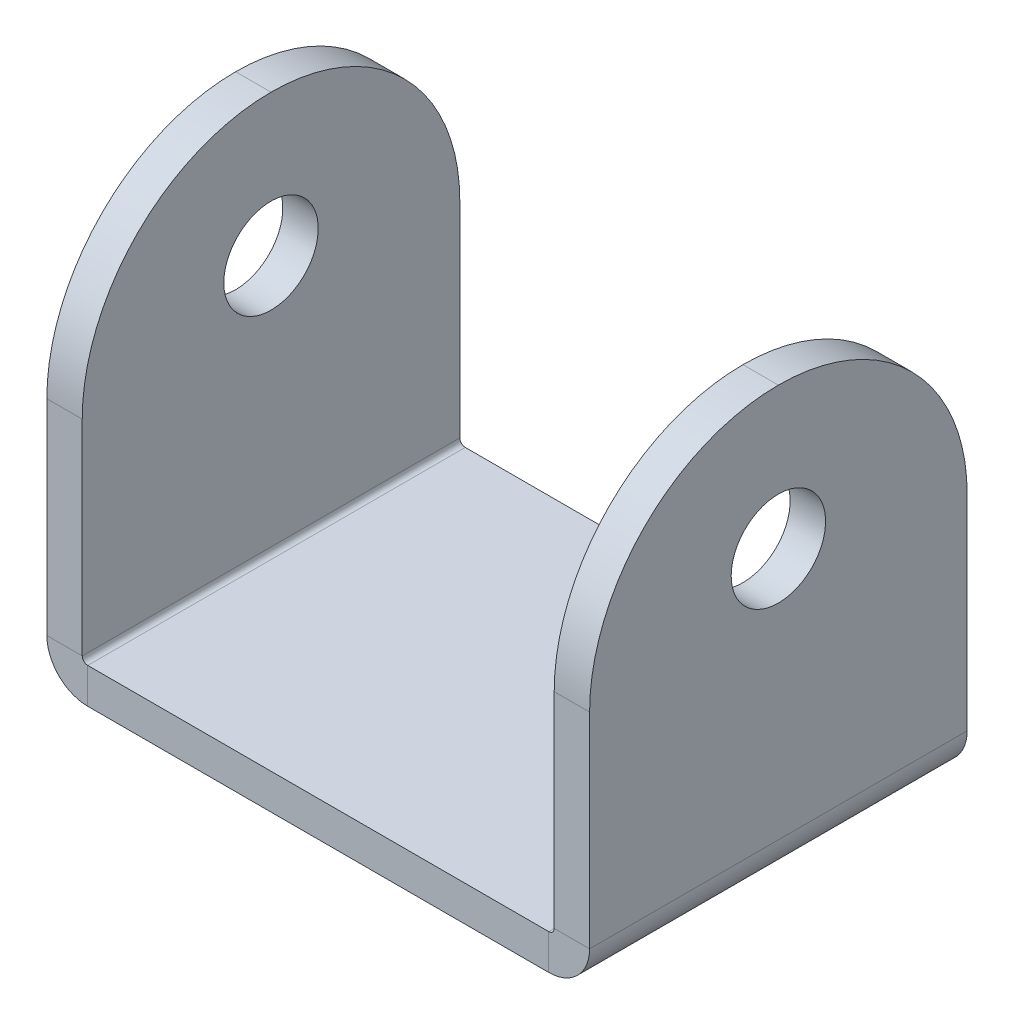
ISO-10303-21;
HEADER;
FILE_DESCRIPTION(('STEP AP214'),'2;1');
FILE_NAME('part.step','',(''),(''),'','','');
FILE_SCHEMA(('AUTOMOTIVE_DESIGN { 1 0 10303 214 1 1 1 1 }'));
ENDSEC;
DATA;
#1=APPLICATION_CONTEXT('core data for automotive mechanical design processes');
#2=APPLICATION_PROTOCOL_DEFINITION('international standard','automotive_design',2000,#1);
#3=PRODUCT_CONTEXT('',#1,'mechanical');
#4=PRODUCT('Part','Part','',(#3));
#5=PRODUCT_RELATED_PRODUCT_CATEGORY('part','',(#4));
#6=PRODUCT_DEFINITION_FORMATION('','',#4);
#7=PRODUCT_DEFINITION_CONTEXT('part definition',#1,'design');
#8=PRODUCT_DEFINITION('design','',#6,#7);
#9=PRODUCT_DEFINITION_SHAPE('','',#8);
#10=(LENGTH_UNIT() NAMED_UNIT(*) SI_UNIT(.MILLI.,.METRE.));
#11=(NAMED_UNIT(*) PLANE_ANGLE_UNIT() SI_UNIT($,.RADIAN.));
#12=(NAMED_UNIT(*) SI_UNIT($,.STERADIAN.) SOLID_ANGLE_UNIT());
#13=UNCERTAINTY_MEASURE_WITH_UNIT(LENGTH_MEASURE(1.E-05),#10,'distance_accuracy_value','');
#14=(GEOMETRIC_REPRESENTATION_CONTEXT(3) GLOBAL_UNCERTAINTY_ASSIGNED_CONTEXT((#13)) GLOBAL_UNIT_ASSIGNED_CONTEXT((#10,
#11,#12)) REPRESENTATION_CONTEXT('',''));
#15=CARTESIAN_POINT('',(0.,0.,0.));
#16=DIRECTION('',(0.,0.,1.));
#17=DIRECTION('',(1.,0.,0.));
#18=AXIS2_PLACEMENT_3D('',#15,#16,#17);
#19=CARTESIAN_POINT('',(-88.9,-4.7625,25.4));
#20=DIRECTION('',(0.,0.,1.));
#21=DIRECTION('',(1.,0.,0.));
#22=AXIS2_PLACEMENT_3D('',#19,#20,#21);
#23=PLANE('',#22);
#24=DIRECTION('',(1.,0.,0.));
#25=VECTOR('',#24,1.);
#26=CARTESIAN_POINT('',(-88.9,-4.7625,25.4));
#27=LINE('',#26,#25);
#28=CARTESIAN_POINT('',(-31.0134,-4.7625,25.4));
#29=VERTEX_POINT('',#28);
#30=CARTESIAN_POINT('',(31.0134,-4.7625,25.4));
#31=VERTEX_POINT('',#30);
#32=EDGE_CURVE('E305',#29,#31,#27,.T.);
#33=ORIENTED_EDGE('',*,*,#32,.T.);
#34=DIRECTION('',(0.,1.,0.));
#35=VECTOR('',#34,1.);
#36=CARTESIAN_POINT('',(31.0134,-4.7625,25.4));
#37=LINE('',#36,#35);
#38=CARTESIAN_POINT('',(31.0134,0.,25.4));
#39=VERTEX_POINT('',#38);
#40=EDGE_CURVE('E12',#31,#39,#37,.T.);
#41=ORIENTED_EDGE('',*,*,#40,.T.);
#42=DIRECTION('',(1.,0.,0.));
#43=VECTOR('',#42,1.);
#44=CARTESIAN_POINT('',(-88.9,0.,25.4));
#45=LINE('',#44,#43);
#46=CARTESIAN_POINT('',(-31.0134,0.,25.4));
#47=VERTEX_POINT('',#46);
#48=EDGE_CURVE('E363',#47,#39,#45,.T.);
#49=ORIENTED_EDGE('',*,*,#48,.F.);
#50=DIRECTION('',(0.,1.,0.));
#51=VECTOR('',#50,1.);
#52=CARTESIAN_POINT('',(-31.0134,-4.7625,25.4));
#53=LINE('',#52,#51);
#54=EDGE_CURVE('E276',#29,#47,#53,.T.);
#55=ORIENTED_EDGE('',*,*,#54,.F.);
#56=EDGE_LOOP('',(#33,#41,#49,#55));
#57=FACE_BOUND('',#56,.T.);
#58=ADVANCED_FACE('F54',(#57),#23,.T.);
#59=CARTESIAN_POINT('',(0.,0.,0.));
#60=DIRECTION('',(0.,1.,0.));
#61=DIRECTION('',(0.,0.,1.));
#62=AXIS2_PLACEMENT_3D('',#59,#60,#61);
#63=PLANE('',#62);
#64=ORIENTED_EDGE('',*,*,#48,.T.);
#65=DIRECTION('',(0.,0.,-1.));
#66=VECTOR('',#65,1.);
#67=CARTESIAN_POINT('',(31.0134,0.,0.));
#68=LINE('',#67,#66);
#69=CARTESIAN_POINT('',(31.0134,0.,-25.4));
#70=VERTEX_POINT('',#69);
#71=EDGE_CURVE('E62',#39,#70,#68,.T.);
#72=ORIENTED_EDGE('',*,*,#71,.T.);
#73=DIRECTION('',(-1.,0.,0.));
#74=VECTOR('',#73,1.);
#75=CARTESIAN_POINT('',(-88.9,0.,-25.4));
#76=LINE('',#75,#74);
#77=CARTESIAN_POINT('',(-31.0134,0.,-25.4));
#78=VERTEX_POINT('',#77);
#79=EDGE_CURVE('E361',#70,#78,#76,.T.);
#80=ORIENTED_EDGE('',*,*,#79,.T.);
#81=DIRECTION('',(0.,0.,-1.));
#82=VECTOR('',#81,1.);
#83=CARTESIAN_POINT('',(-31.0134,0.,0.));
#84=LINE('',#83,#82);
#85=EDGE_CURVE('E290',#47,#78,#84,.T.);
#86=ORIENTED_EDGE('',*,*,#85,.F.);
#87=EDGE_LOOP('',(#64,#72,#80,#86));
#88=FACE_BOUND('',#87,.T.);
#89=ADVANCED_FACE('F425',(#88),#63,.T.);
#90=CARTESIAN_POINT('',(-88.9,-4.7625,-25.4));
#91=DIRECTION('',(0.,0.,-1.));
#92=DIRECTION('',(-1.,0.,0.));
#93=AXIS2_PLACEMENT_3D('',#90,#91,#92);
#94=PLANE('',#93);
#95=ORIENTED_EDGE('',*,*,#79,.F.);
#96=DIRECTION('',(0.,-1.,0.));
#97=VECTOR('',#96,1.);
#98=CARTESIAN_POINT('',(31.0134,-4.7625,-25.4));
#99=LINE('',#98,#97);
#100=CARTESIAN_POINT('',(31.0134,-4.7625,-25.4));
#101=VERTEX_POINT('',#100);
#102=EDGE_CURVE('E352',#70,#101,#99,.T.);
#103=ORIENTED_EDGE('',*,*,#102,.T.);
#104=DIRECTION('',(-1.,0.,0.));
#105=VECTOR('',#104,1.);
#106=CARTESIAN_POINT('',(-88.9,-4.7625,-25.4));
#107=LINE('',#106,#105);
#108=CARTESIAN_POINT('',(-31.0134,-4.7625,-25.4));
#109=VERTEX_POINT('',#108);
#110=EDGE_CURVE('E57',#101,#109,#107,.T.);
#111=ORIENTED_EDGE('',*,*,#110,.T.);
#112=DIRECTION('',(0.,-1.,0.));
#113=VECTOR('',#112,1.);
#114=CARTESIAN_POINT('',(-31.0134,-4.7625,-25.4));
#115=LINE('',#114,#113);
#116=EDGE_CURVE('E287',#78,#109,#115,.T.);
#117=ORIENTED_EDGE('',*,*,#116,.F.);
#118=EDGE_LOOP('',(#95,#103,#111,#117));
#119=FACE_BOUND('',#118,.T.);
#120=ADVANCED_FACE('F373',(#119),#94,.T.);
#121=CARTESIAN_POINT('',(-36.5124999999998,53.7256926725026,25.4));
#122=DIRECTION('',(0.,0.,1.));
#123=DIRECTION('',(0.,-1.,0.));
#124=AXIS2_PLACEMENT_3D('',#121,#122,#123);
#125=PLANE('',#124);
#126=DIRECTION('',(0.,-1.,0.));
#127=VECTOR('',#126,1.);
#128=CARTESIAN_POINT('',(-36.5124999999998,53.7256926725026,25.4));
#129=LINE('',#128,#127);
#130=CARTESIAN_POINT('',(-36.5124999999999,28.3256926725026,25.4));
#131=VERTEX_POINT('',#130);
#132=CARTESIAN_POINT('',(-36.5125,0.736600000000032,25.4));
#133=VERTEX_POINT('',#132);
#134=EDGE_CURVE('E310',#131,#133,#129,.T.);
#135=ORIENTED_EDGE('',*,*,#134,.T.);
#136=DIRECTION('',(1.,0.,0.));
#137=VECTOR('',#136,1.);
#138=CARTESIAN_POINT('',(-36.5125,0.736600000000025,25.4));
#139=LINE('',#138,#137);
#140=CARTESIAN_POINT('',(-31.75,0.736600000000011,25.4));
#141=VERTEX_POINT('',#140);
#142=EDGE_CURVE('E337',#133,#141,#139,.T.);
#143=ORIENTED_EDGE('',*,*,#142,.T.);
#144=DIRECTION('',(0.,-1.,0.));
#145=VECTOR('',#144,1.);
#146=CARTESIAN_POINT('',(-31.7499999999998,53.7256926725025,25.4));
#147=LINE('',#146,#145);
#148=CARTESIAN_POINT('',(-31.7499999999999,28.3256926725026,25.4));
#149=VERTEX_POINT('',#148);
#150=EDGE_CURVE('E84',#149,#141,#147,.T.);
#151=ORIENTED_EDGE('',*,*,#150,.F.);
#152=DIRECTION('',(1.,0.,0.));
#153=VECTOR('',#152,1.);
#154=CARTESIAN_POINT('',(-36.5124999999999,28.3256926725026,25.4));
#155=LINE('',#154,#153);
#156=EDGE_CURVE('E323',#149,#131,#155,.F.);
#157=ORIENTED_EDGE('',*,*,#156,.T.);
#158=EDGE_LOOP('',(#135,#143,#151,#157));
#159=FACE_BOUND('',#158,.T.);
#160=ADVANCED_FACE('F395',(#159),#125,.T.);
#161=CARTESIAN_POINT('',(-36.5124999999998,53.7256926725025,-25.4));
#162=DIRECTION('',(0.,0.,-1.));
#163=DIRECTION('',(0.,1.,0.));
#164=AXIS2_PLACEMENT_3D('',#161,#162,#163);
#165=PLANE('',#164);
#166=DIRECTION('',(0.,1.,0.));
#167=VECTOR('',#166,1.);
#168=CARTESIAN_POINT('',(-31.7499999999998,53.7256926725025,-25.4));
#169=LINE('',#168,#167);
#170=CARTESIAN_POINT('',(-31.75,0.736600000000011,-25.4));
#171=VERTEX_POINT('',#170);
#172=CARTESIAN_POINT('',(-31.7499999999999,28.3256926725025,-25.4));
#173=VERTEX_POINT('',#172);
#174=EDGE_CURVE('E328',#171,#173,#169,.T.);
#175=ORIENTED_EDGE('',*,*,#174,.F.);
#176=DIRECTION('',(-1.,0.,0.));
#177=VECTOR('',#176,1.);
#178=CARTESIAN_POINT('',(-36.5125,0.736600000000025,-25.4));
#179=LINE('',#178,#177);
#180=CARTESIAN_POINT('',(-36.5125,0.736600000000012,-25.4));
#181=VERTEX_POINT('',#180);
#182=EDGE_CURVE('E332',#171,#181,#179,.T.);
#183=ORIENTED_EDGE('',*,*,#182,.T.);
#184=DIRECTION('',(0.,1.,0.));
#185=VECTOR('',#184,1.);
#186=CARTESIAN_POINT('',(-36.5124999999998,53.7256926725025,-25.4));
#187=LINE('',#186,#185);
#188=CARTESIAN_POINT('',(-36.5124999999999,28.3256926725025,-25.4));
#189=VERTEX_POINT('',#188);
#190=EDGE_CURVE('E343',#181,#189,#187,.T.);
#191=ORIENTED_EDGE('',*,*,#190,.T.);
#192=DIRECTION('',(1.,0.,0.));
#193=VECTOR('',#192,1.);
#194=CARTESIAN_POINT('',(-36.5124999999999,28.3256926725025,-25.4));
#195=LINE('',#194,#193);
#196=EDGE_CURVE('E306',#189,#173,#195,.T.);
#197=ORIENTED_EDGE('',*,*,#196,.T.);
#198=EDGE_LOOP('',(#175,#183,#191,#197));
#199=FACE_BOUND('',#198,.T.);
#200=ADVANCED_FACE('F406',(#199),#165,.T.);
#201=CARTESIAN_POINT('',(-31.7500000000001,-35.1743073274975,0.));
#202=DIRECTION('',(1.,0.,0.));
#203=DIRECTION('',(0.,0.,1.));
#204=AXIS2_PLACEMENT_3D('',#201,#202,#203);
#205=PLANE('',#204);
#206=CARTESIAN_POINT('',(-31.7499999999999,34.6756926725025,0.));
#207=DIRECTION('',(1.,0.,0.));
#208=DIRECTION('',(0.,0.,1.));
#209=AXIS2_PLACEMENT_3D('',#206,#207,#208);
#210=CIRCLE('',#209,6.35000000000001);
#211=CARTESIAN_POINT('',(-31.7499999999999,34.6756926725025,6.35));
#212=VERTEX_POINT('',#211);
#213=EDGE_CURVE('E301',#212,#212,#210,.T.);
#214=ORIENTED_EDGE('',*,*,#213,.F.);
#215=EDGE_LOOP('',(#214));
#216=FACE_BOUND('',#215,.T.);
#217=ORIENTED_EDGE('',*,*,#150,.T.);
#218=DIRECTION('',(0.,0.,-1.));
#219=VECTOR('',#218,1.);
#220=CARTESIAN_POINT('',(-31.75,0.736600000000011,0.));
#221=LINE('',#220,#219);
#222=EDGE_CURVE('E334',#141,#171,#221,.T.);
#223=ORIENTED_EDGE('',*,*,#222,.T.);
#224=ORIENTED_EDGE('',*,*,#174,.T.);
#225=CARTESIAN_POINT('',(-31.7499999999999,28.3256926725025,0.));
#226=DIRECTION('',(1.,0.,0.));
#227=DIRECTION('',(0.,0.,1.));
#228=AXIS2_PLACEMENT_3D('',#225,#226,#227);
#229=CIRCLE('',#228,25.4);
#230=CARTESIAN_POINT('',(-31.7499999999998,53.7256926725025,0.));
#231=VERTEX_POINT('',#230);
#232=EDGE_CURVE('E313',#173,#231,#229,.T.);
#233=ORIENTED_EDGE('',*,*,#232,.T.);
#234=CARTESIAN_POINT('',(-31.7499999999999,28.3256926725025,0.));
#235=DIRECTION('',(1.,0.,0.));
#236=DIRECTION('',(0.,0.,1.));
#237=AXIS2_PLACEMENT_3D('',#234,#235,#236);
#238=CIRCLE('',#237,25.4);
#239=EDGE_CURVE('E309',#231,#149,#238,.T.);
#240=ORIENTED_EDGE('',*,*,#239,.T.);
#241=EDGE_LOOP('',(#217,#223,#224,#233,#240));
#242=FACE_BOUND('',#241,.T.);
#243=ADVANCED_FACE('F403',(#216,#242),#205,.T.);
#244=CARTESIAN_POINT('',(-36.5125000000001,-35.1743073274975,0.));
#245=DIRECTION('',(1.,0.,0.));
#246=DIRECTION('',(0.,0.,1.));
#247=AXIS2_PLACEMENT_3D('',#244,#245,#246);
#248=PLANE('',#247);
#249=DIRECTION('',(0.,0.,-1.));
#250=VECTOR('',#249,1.);
#251=CARTESIAN_POINT('',(-36.5125,0.736600000000025,0.));
#252=LINE('',#251,#250);
#253=EDGE_CURVE('E325',#133,#181,#252,.T.);
#254=ORIENTED_EDGE('',*,*,#253,.F.);
#255=ORIENTED_EDGE('',*,*,#134,.F.);
#256=CARTESIAN_POINT('',(-36.5124999999999,28.3256926725026,0.));
#257=DIRECTION('',(1.,0.,0.));
#258=DIRECTION('',(0.,0.,1.));
#259=AXIS2_PLACEMENT_3D('',#256,#257,#258);
#260=CIRCLE('',#259,25.4);
#261=CARTESIAN_POINT('',(-36.5124999999998,53.7256926725025,0.));
#262=VERTEX_POINT('',#261);
#263=EDGE_CURVE('E316',#131,#262,#260,.F.);
#264=ORIENTED_EDGE('',*,*,#263,.T.);
#265=CARTESIAN_POINT('',(-36.5124999999999,28.3256926725026,0.));
#266=DIRECTION('',(1.,0.,0.));
#267=DIRECTION('',(0.,0.,1.));
#268=AXIS2_PLACEMENT_3D('',#265,#266,#267);
#269=CIRCLE('',#268,25.4);
#270=EDGE_CURVE('E319',#262,#189,#269,.F.);
#271=ORIENTED_EDGE('',*,*,#270,.T.);
#272=ORIENTED_EDGE('',*,*,#190,.F.);
#273=EDGE_LOOP('',(#254,#255,#264,#271,#272));
#274=FACE_BOUND('',#273,.T.);
#275=CARTESIAN_POINT('',(-36.5124999999999,34.6756926725025,0.));
#276=DIRECTION('',(1.,0.,0.));
#277=DIRECTION('',(0.,0.,1.));
#278=AXIS2_PLACEMENT_3D('',#275,#276,#277);
#279=CIRCLE('',#278,6.35000000000001);
#280=CARTESIAN_POINT('',(-36.5124999999999,34.6756926725025,6.35));
#281=VERTEX_POINT('',#280);
#282=EDGE_CURVE('E296',#281,#281,#279,.T.);
#283=ORIENTED_EDGE('',*,*,#282,.T.);
#284=EDGE_LOOP('',(#283));
#285=FACE_BOUND('',#284,.T.);
#286=ADVANCED_FACE('F390',(#274,#285),#248,.F.);
#287=CARTESIAN_POINT('',(-36.5124999999999,28.3256926725026,0.));
#288=DIRECTION('',(1.,0.,0.));
#289=DIRECTION('',(0.,0.,1.));
#290=AXIS2_PLACEMENT_3D('',#287,#288,#289);
#291=CYLINDRICAL_SURFACE('',#290,25.4);
#292=DIRECTION('',(1.,0.,0.));
#293=VECTOR('',#292,1.);
#294=CARTESIAN_POINT('',(-36.5124999999998,53.7256926725025,0.));
#295=LINE('',#294,#293);
#296=EDGE_CURVE('E300',#262,#231,#295,.T.);
#297=ORIENTED_EDGE('',*,*,#296,.F.);
#298=ORIENTED_EDGE('',*,*,#263,.F.);
#299=ORIENTED_EDGE('',*,*,#156,.F.);
#300=ORIENTED_EDGE('',*,*,#239,.F.);
#301=EDGE_LOOP('',(#297,#298,#299,#300));
#302=FACE_BOUND('',#301,.T.);
#303=ADVANCED_FACE('F414',(#302),#291,.T.);
#304=CARTESIAN_POINT('',(-36.5124999999999,28.3256926725026,0.));
#305=DIRECTION('',(1.,0.,0.));
#306=DIRECTION('',(0.,0.,1.));
#307=AXIS2_PLACEMENT_3D('',#304,#305,#306);
#308=CYLINDRICAL_SURFACE('',#307,25.4);
#309=ORIENTED_EDGE('',*,*,#270,.F.);
#310=ORIENTED_EDGE('',*,*,#296,.T.);
#311=ORIENTED_EDGE('',*,*,#232,.F.);
#312=ORIENTED_EDGE('',*,*,#196,.F.);
#313=EDGE_LOOP('',(#309,#310,#311,#312));
#314=FACE_BOUND('',#313,.T.);
#315=ADVANCED_FACE('F410',(#314),#308,.T.);
#316=CARTESIAN_POINT('',(-36.5124999999999,34.6756926725025,0.));
#317=DIRECTION('',(1.,0.,0.));
#318=DIRECTION('',(0.,0.,1.));
#319=AXIS2_PLACEMENT_3D('',#316,#317,#318);
#320=CYLINDRICAL_SURFACE('',#319,6.35000000000001);
#321=CARTESIAN_POINT('',(-36.5124999999999,34.6756926725025,6.35));
#322=CARTESIAN_POINT('',(-36.4628906249999,34.6756926725025,6.35));
#323=CARTESIAN_POINT('',(-36.4132812499999,34.6756926725025,6.35));
#324=CARTESIAN_POINT('',(-36.3140624999999,34.6756926725025,6.35));
#325=CARTESIAN_POINT('',(-36.2644531249999,34.6756926725025,6.35));
#326=CARTESIAN_POINT('',(-36.1652343749999,34.6756926725025,6.35));
#327=CARTESIAN_POINT('',(-36.1156249999999,34.6756926725025,6.35));
#328=CARTESIAN_POINT('',(-36.0164062499999,34.6756926725025,6.35));
#329=CARTESIAN_POINT('',(-35.9667968749999,34.6756926725025,6.35));
#330=CARTESIAN_POINT('',(-35.8675781249999,34.6756926725025,6.35));
#331=CARTESIAN_POINT('',(-35.8179687499999,34.6756926725025,6.35));
#332=CARTESIAN_POINT('',(-35.7187499999999,34.6756926725025,6.35));
#333=CARTESIAN_POINT('',(-35.6691406249999,34.6756926725025,6.35));
#334=CARTESIAN_POINT('',(-35.5699218749999,34.6756926725025,6.35));
#335=CARTESIAN_POINT('',(-35.5203124999999,34.6756926725025,6.35));
#336=CARTESIAN_POINT('',(-35.4210937499999,34.6756926725025,6.35));
#337=CARTESIAN_POINT('',(-35.3714843749999,34.6756926725025,6.35));
#338=CARTESIAN_POINT('',(-35.2722656249999,34.6756926725025,6.35));
#339=CARTESIAN_POINT('',(-35.2226562499999,34.6756926725025,6.35));
#340=CARTESIAN_POINT('',(-35.1234374999999,34.6756926725025,6.35));
#341=CARTESIAN_POINT('',(-35.0738281249999,34.6756926725025,6.35));
#342=CARTESIAN_POINT('',(-34.9746093749999,34.6756926725025,6.35));
#343=CARTESIAN_POINT('',(-34.9249999999999,34.6756926725025,6.35));
#344=CARTESIAN_POINT('',(-34.8257812499999,34.6756926725025,6.35));
#345=CARTESIAN_POINT('',(-34.7761718749999,34.6756926725025,6.35));
#346=CARTESIAN_POINT('',(-34.6769531249999,34.6756926725025,6.35));
#347=CARTESIAN_POINT('',(-34.6273437499999,34.6756926725025,6.35));
#348=CARTESIAN_POINT('',(-34.5281249999999,34.6756926725025,6.35));
#349=CARTESIAN_POINT('',(-34.4785156249999,34.6756926725025,6.35));
#350=CARTESIAN_POINT('',(-34.3792968749999,34.6756926725025,6.35));
#351=CARTESIAN_POINT('',(-34.3296874999999,34.6756926725025,6.35));
#352=CARTESIAN_POINT('',(-34.2304687499999,34.6756926725025,6.35));
#353=CARTESIAN_POINT('',(-34.1808593749999,34.6756926725025,6.35));
#354=CARTESIAN_POINT('',(-34.0816406249999,34.6756926725025,6.35));
#355=CARTESIAN_POINT('',(-34.0320312499999,34.6756926725025,6.35));
#356=CARTESIAN_POINT('',(-33.9328124999999,34.6756926725025,6.35));
#357=CARTESIAN_POINT('',(-33.8832031249999,34.6756926725025,6.35));
#358=CARTESIAN_POINT('',(-33.7839843749999,34.6756926725025,6.35));
#359=CARTESIAN_POINT('',(-33.7343749999999,34.6756926725025,6.35));
#360=CARTESIAN_POINT('',(-33.6351562499999,34.6756926725025,6.35));
#361=CARTESIAN_POINT('',(-33.5855468749999,34.6756926725025,6.35));
#362=CARTESIAN_POINT('',(-33.4863281249999,34.6756926725025,6.35));
#363=CARTESIAN_POINT('',(-33.4367187499999,34.6756926725025,6.35));
#364=CARTESIAN_POINT('',(-33.3374999999999,34.6756926725025,6.35));
#365=CARTESIAN_POINT('',(-33.2878906249999,34.6756926725025,6.35));
#366=CARTESIAN_POINT('',(-33.1886718749999,34.6756926725025,6.35));
#367=CARTESIAN_POINT('',(-33.1390624999999,34.6756926725025,6.35));
#368=CARTESIAN_POINT('',(-33.0398437499999,34.6756926725025,6.35));
#369=CARTESIAN_POINT('',(-32.9902343749999,34.6756926725025,6.35));
#370=CARTESIAN_POINT('',(-32.8910156249999,34.6756926725025,6.35));
#371=CARTESIAN_POINT('',(-32.8414062499999,34.6756926725025,6.35));
#372=CARTESIAN_POINT('',(-32.7421874999999,34.6756926725025,6.35));
#373=CARTESIAN_POINT('',(-32.6925781249999,34.6756926725025,6.35));
#374=CARTESIAN_POINT('',(-32.5933593749999,34.6756926725025,6.35));
#375=CARTESIAN_POINT('',(-32.5437499999999,34.6756926725025,6.35));
#376=CARTESIAN_POINT('',(-32.4445312499999,34.6756926725025,6.35));
#377=CARTESIAN_POINT('',(-32.3949218749999,34.6756926725025,6.35));
#378=CARTESIAN_POINT('',(-32.2957031249999,34.6756926725025,6.35));
#379=CARTESIAN_POINT('',(-32.2460937499999,34.6756926725025,6.35));
#380=CARTESIAN_POINT('',(-32.1468749999999,34.6756926725025,6.35));
#381=CARTESIAN_POINT('',(-32.0972656249999,34.6756926725025,6.35));
#382=CARTESIAN_POINT('',(-31.9980468749999,34.6756926725025,6.35));
#383=CARTESIAN_POINT('',(-31.9484374999999,34.6756926725025,6.35));
#384=CARTESIAN_POINT('',(-31.8492187499999,34.6756926725025,6.35));
#385=CARTESIAN_POINT('',(-31.7996093749999,34.6756926725025,6.35));
#386=CARTESIAN_POINT('',(-31.7499999999999,34.6756926725025,6.35));
#387=B_SPLINE_CURVE_WITH_KNOTS('',3,(#321,#322,#323,#324,#325,#326,#327,#328,#329,#330,#331,
#332,#333,#334,#335,#336,#337,#338,#339,#340,#341,#342,#343,#344,#345,#346,#347,#348,#349,#350,
#351,#352,#353,#354,#355,#356,#357,#358,#359,#360,#361,#362,#363,#364,#365,#366,#367,#368,#369,
#370,#371,#372,#373,#374,#375,#376,#377,#378,#379,#380,#381,#382,#383,#384,#385,#386),
.UNSPECIFIED.,.F.,.F.,(4,2,2,2,2,2,2,2,2,2,2,2,2,2,2,2,2,2,2,2,2,2,2,2,2,2,2,2,2,2,2,2,4),(0.,
0.148828124999993,0.297656249999993,0.446484374999993,0.595312499999993,0.744140624999994,
0.892968749999994,1.04179687499999,1.19062499999999,1.33945312499999,1.48828124999999,
1.63710937499999,1.78593749999999,1.93476562499999,2.08359374999999,2.23242187499999,
2.38124999999999,2.53007812499999,2.67890624999999,2.82773437499999,2.97656249999999,
3.12539062499999,3.27421874999999,3.42304687499999,3.571875,3.720703125,3.86953125,4.018359375,
4.1671875,4.316015625,4.46484374999999,4.61367187499999,4.76249999999999),.UNSPECIFIED.);
#388=EDGE_CURVE('BSEAM420',#281,#212,#387,.T.);
#389=ORIENTED_EDGE('',*,*,#282,.F.);
#390=ORIENTED_EDGE('',*,*,#213,.T.);
#391=ORIENTED_EDGE('',*,*,#388,.T.);
#392=ORIENTED_EDGE('',*,*,#388,.F.);
#393=EDGE_LOOP('',(#389,#391,#390,#392));
#394=FACE_BOUND('',#393,.T.);
#395=ADVANCED_FACE('F420',(#394),#320,.F.);
#396=CARTESIAN_POINT('',(0.,-4.7625,0.));
#397=DIRECTION('',(0.,1.,0.));
#398=DIRECTION('',(0.,0.,1.));
#399=AXIS2_PLACEMENT_3D('',#396,#397,#398);
#400=PLANE('',#399);
#401=DIRECTION('',(0.,0.,-1.));
#402=VECTOR('',#401,1.);
#403=CARTESIAN_POINT('',(31.0134,-4.7625,0.));
#404=LINE('',#403,#402);
#405=EDGE_CURVE('E339',#31,#101,#404,.T.);
#406=ORIENTED_EDGE('',*,*,#405,.F.);
#407=ORIENTED_EDGE('',*,*,#32,.F.);
#408=DIRECTION('',(0.,0.,-1.));
#409=VECTOR('',#408,1.);
#410=CARTESIAN_POINT('',(-31.0134,-4.7625,0.));
#411=LINE('',#410,#409);
#412=EDGE_CURVE('E283',#29,#109,#411,.T.);
#413=ORIENTED_EDGE('',*,*,#412,.T.);
#414=ORIENTED_EDGE('',*,*,#110,.F.);
#415=EDGE_LOOP('',(#406,#407,#413,#414));
#416=FACE_BOUND('',#415,.T.);
#417=ADVANCED_FACE('F377',(#416),#400,.F.);
#418=CARTESIAN_POINT('',(-31.0134,0.7366,25.4));
#419=DIRECTION('',(0.,0.,1.));
#420=DIRECTION('',(1.,0.,0.));
#421=AXIS2_PLACEMENT_3D('',#418,#419,#420);
#422=PLANE('',#421);
#423=ORIENTED_EDGE('',*,*,#54,.T.);
#424=CARTESIAN_POINT('',(-31.0134,0.7366,25.4));
#425=DIRECTION('',(0.,0.,-1.));
#426=DIRECTION('',(-1.,0.,0.));
#427=AXIS2_PLACEMENT_3D('',#424,#425,#426);
#428=CIRCLE('',#427,0.7366);
#429=EDGE_CURVE('E262',#47,#141,#428,.T.);
#430=ORIENTED_EDGE('',*,*,#429,.T.);
#431=ORIENTED_EDGE('',*,*,#142,.F.);
#432=CARTESIAN_POINT('',(-31.0134,0.7366,25.4));
#433=DIRECTION('',(0.,0.,-1.));
#434=DIRECTION('',(1.,0.,0.));
#435=AXIS2_PLACEMENT_3D('',#432,#433,#434);
#436=CIRCLE('',#435,5.4991);
#437=EDGE_CURVE('E267',#29,#133,#436,.T.);
#438=ORIENTED_EDGE('',*,*,#437,.F.);
#439=EDGE_LOOP('',(#423,#430,#431,#438));
#440=FACE_BOUND('',#439,.T.);
#441=ADVANCED_FACE('F399',(#440),#422,.T.);
#442=CARTESIAN_POINT('',(-31.0134,0.7366,-25.4));
#443=DIRECTION('',(0.,0.,-1.));
#444=DIRECTION('',(-1.,0.,0.));
#445=AXIS2_PLACEMENT_3D('',#442,#443,#444);
#446=PLANE('',#445);
#447=ORIENTED_EDGE('',*,*,#182,.F.);
#448=CARTESIAN_POINT('',(-31.0134,0.7366,-25.4));
#449=DIRECTION('',(0.,0.,-1.));
#450=DIRECTION('',(-1.,0.,0.));
#451=AXIS2_PLACEMENT_3D('',#448,#449,#450);
#452=CIRCLE('',#451,0.7366);
#453=EDGE_CURVE('E272',#171,#78,#452,.F.);
#454=ORIENTED_EDGE('',*,*,#453,.T.);
#455=ORIENTED_EDGE('',*,*,#116,.T.);
#456=CARTESIAN_POINT('',(-31.0134,0.7366,-25.4));
#457=DIRECTION('',(0.,0.,1.));
#458=DIRECTION('',(-1.,0.,0.));
#459=AXIS2_PLACEMENT_3D('',#456,#457,#458);
#460=CIRCLE('',#459,5.4991);
#461=EDGE_CURVE('E271',#181,#109,#460,.T.);
#462=ORIENTED_EDGE('',*,*,#461,.F.);
#463=EDGE_LOOP('',(#447,#454,#455,#462));
#464=FACE_BOUND('',#463,.T.);
#465=ADVANCED_FACE('F383',(#464),#446,.T.);
#466=CARTESIAN_POINT('',(-31.0134,0.7366,51.2572627465893));
#467=DIRECTION('',(0.,0.,-1.));
#468=DIRECTION('',(-1.,0.,0.));
#469=AXIS2_PLACEMENT_3D('',#466,#467,#468);
#470=CYLINDRICAL_SURFACE('',#469,5.4991);
#471=ORIENTED_EDGE('',*,*,#461,.T.);
#472=ORIENTED_EDGE('',*,*,#412,.F.);
#473=ORIENTED_EDGE('',*,*,#437,.T.);
#474=ORIENTED_EDGE('',*,*,#253,.T.);
#475=EDGE_LOOP('',(#471,#472,#473,#474));
#476=FACE_BOUND('',#475,.T.);
#477=ADVANCED_FACE('F385',(#476),#470,.T.);
#478=CARTESIAN_POINT('',(-31.0134,0.7366,51.2572627465893));
#479=DIRECTION('',(0.,0.,-1.));
#480=DIRECTION('',(-1.,0.,0.));
#481=AXIS2_PLACEMENT_3D('',#478,#479,#480);
#482=CYLINDRICAL_SURFACE('',#481,0.7366);
#483=ORIENTED_EDGE('',*,*,#453,.F.);
#484=ORIENTED_EDGE('',*,*,#222,.F.);
#485=ORIENTED_EDGE('',*,*,#429,.F.);
#486=ORIENTED_EDGE('',*,*,#85,.T.);
#487=EDGE_LOOP('',(#483,#484,#485,#486));
#488=FACE_BOUND('',#487,.T.);
#489=ADVANCED_FACE('F402',(#488),#482,.F.);
#490=CARTESIAN_POINT('',(31.0134,0.7366,25.4));
#491=DIRECTION('',(0.,0.,1.));
#492=DIRECTION('',(1.,0.,0.));
#493=AXIS2_PLACEMENT_3D('',#490,#491,#492);
#494=PLANE('',#493);
#495=DIRECTION('',(-1.,0.,0.));
#496=VECTOR('',#495,1.);
#497=CARTESIAN_POINT('',(36.5125,0.736600000000018,25.4));
#498=LINE('',#497,#496);
#499=CARTESIAN_POINT('',(36.5125,0.736600000000024,25.4));
#500=VERTEX_POINT('',#499);
#501=CARTESIAN_POINT('',(31.75,0.736600000000004,25.4));
#502=VERTEX_POINT('',#501);
#503=EDGE_CURVE('E192',#500,#502,#498,.T.);
#504=ORIENTED_EDGE('',*,*,#503,.T.);
#505=CARTESIAN_POINT('',(31.0134,0.7366,25.4));
#506=DIRECTION('',(0.,0.,1.));
#507=DIRECTION('',(1.,0.,0.));
#508=AXIS2_PLACEMENT_3D('',#505,#506,#507);
#509=CIRCLE('',#508,0.7366);
#510=EDGE_CURVE('E73',#502,#39,#509,.F.);
#511=ORIENTED_EDGE('',*,*,#510,.T.);
#512=ORIENTED_EDGE('',*,*,#40,.F.);
#513=CARTESIAN_POINT('',(31.0134,0.7366,25.4));
#514=DIRECTION('',(0.,0.,-1.));
#515=DIRECTION('',(1.,0.,0.));
#516=AXIS2_PLACEMENT_3D('',#513,#514,#515);
#517=CIRCLE('',#516,5.4991);
#518=EDGE_CURVE('E255',#500,#31,#517,.T.);
#519=ORIENTED_EDGE('',*,*,#518,.F.);
#520=EDGE_LOOP('',(#504,#511,#512,#519));
#521=FACE_BOUND('',#520,.T.);
#522=ADVANCED_FACE('F442',(#521),#494,.T.);
#523=CARTESIAN_POINT('',(31.0134,0.7366,-25.4));
#524=DIRECTION('',(0.,0.,-1.));
#525=DIRECTION('',(-1.,0.,0.));
#526=AXIS2_PLACEMENT_3D('',#523,#524,#525);
#527=PLANE('',#526);
#528=CARTESIAN_POINT('',(31.0134,0.7366,-25.4));
#529=DIRECTION('',(0.,0.,1.));
#530=DIRECTION('',(1.,0.,0.));
#531=AXIS2_PLACEMENT_3D('',#528,#529,#530);
#532=CIRCLE('',#531,0.7366);
#533=CARTESIAN_POINT('',(31.75,0.736600000000004,-25.4));
#534=VERTEX_POINT('',#533);
#535=EDGE_CURVE('E213',#70,#534,#532,.T.);
#536=ORIENTED_EDGE('',*,*,#535,.T.);
#537=DIRECTION('',(1.,0.,0.));
#538=VECTOR('',#537,1.);
#539=CARTESIAN_POINT('',(36.5125,0.736600000000018,-25.4));
#540=LINE('',#539,#538);
#541=CARTESIAN_POINT('',(36.5125,0.736600000000018,-25.4));
#542=VERTEX_POINT('',#541);
#543=EDGE_CURVE('E247',#534,#542,#540,.T.);
#544=ORIENTED_EDGE('',*,*,#543,.T.);
#545=CARTESIAN_POINT('',(31.0134,0.7366,-25.4));
#546=DIRECTION('',(0.,0.,1.));
#547=DIRECTION('',(-1.,0.,0.));
#548=AXIS2_PLACEMENT_3D('',#545,#546,#547);
#549=CIRCLE('',#548,5.4991);
#550=EDGE_CURVE('E259',#101,#542,#549,.T.);
#551=ORIENTED_EDGE('',*,*,#550,.F.);
#552=ORIENTED_EDGE('',*,*,#102,.F.);
#553=EDGE_LOOP('',(#536,#544,#551,#552));
#554=FACE_BOUND('',#553,.T.);
#555=ADVANCED_FACE('F436',(#554),#527,.T.);
#556=CARTESIAN_POINT('',(31.0134,0.7366,-51.2572627465893));
#557=DIRECTION('',(0.,0.,1.));
#558=DIRECTION('',(1.,0.,0.));
#559=AXIS2_PLACEMENT_3D('',#556,#557,#558);
#560=CYLINDRICAL_SURFACE('',#559,5.4991);
#561=ORIENTED_EDGE('',*,*,#405,.T.);
#562=ORIENTED_EDGE('',*,*,#550,.T.);
#563=DIRECTION('',(0.,0.,-1.));
#564=VECTOR('',#563,1.);
#565=CARTESIAN_POINT('',(36.5125,0.736600000000018,0.));
#566=LINE('',#565,#564);
#567=EDGE_CURVE('E234',#500,#542,#566,.T.);
#568=ORIENTED_EDGE('',*,*,#567,.F.);
#569=ORIENTED_EDGE('',*,*,#518,.T.);
#570=EDGE_LOOP('',(#561,#562,#568,#569));
#571=FACE_BOUND('',#570,.T.);
#572=ADVANCED_FACE('F440',(#571),#560,.T.);
#573=CARTESIAN_POINT('',(31.0134,0.7366,-51.2572627465893));
#574=DIRECTION('',(0.,0.,1.));
#575=DIRECTION('',(1.,0.,0.));
#576=AXIS2_PLACEMENT_3D('',#573,#574,#575);
#577=CYLINDRICAL_SURFACE('',#576,0.7366);
#578=ORIENTED_EDGE('',*,*,#71,.F.);
#579=ORIENTED_EDGE('',*,*,#510,.F.);
#580=DIRECTION('',(0.,0.,-1.));
#581=VECTOR('',#580,1.);
#582=CARTESIAN_POINT('',(31.75,0.736600000000004,0.));
#583=LINE('',#582,#581);
#584=EDGE_CURVE('E250',#502,#534,#583,.T.);
#585=ORIENTED_EDGE('',*,*,#584,.T.);
#586=ORIENTED_EDGE('',*,*,#535,.F.);
#587=EDGE_LOOP('',(#578,#579,#585,#586));
#588=FACE_BOUND('',#587,.T.);
#589=ADVANCED_FACE('F433',(#588),#577,.F.);
#590=CARTESIAN_POINT('',(36.5124999999999,28.3256926725025,0.));
#591=DIRECTION('',(-1.,0.,0.));
#592=DIRECTION('',(0.,0.,1.));
#593=AXIS2_PLACEMENT_3D('',#590,#591,#592);
#594=CYLINDRICAL_SURFACE('',#593,25.4);
#595=DIRECTION('',(-1.,0.,0.));
#596=VECTOR('',#595,1.);
#597=CARTESIAN_POINT('',(36.5124999999999,28.3256926725025,25.4));
#598=LINE('',#597,#596);
#599=CARTESIAN_POINT('',(36.5124999999999,28.3256926725025,25.4));
#600=VERTEX_POINT('',#599);
#601=CARTESIAN_POINT('',(31.7499999999999,28.3256926725025,25.4));
#602=VERTEX_POINT('',#601);
#603=EDGE_CURVE('E190',#600,#602,#598,.T.);
#604=ORIENTED_EDGE('',*,*,#603,.F.);
#605=CARTESIAN_POINT('',(36.5124999999999,28.3256926725025,0.));
#606=DIRECTION('',(-1.,0.,0.));
#607=DIRECTION('',(0.,0.,1.));
#608=AXIS2_PLACEMENT_3D('',#605,#606,#607);
#609=CIRCLE('',#608,25.4);
#610=CARTESIAN_POINT('',(36.5124999999998,53.7256926725025,0.));
#611=VERTEX_POINT('',#610);
#612=EDGE_CURVE('E199',#611,#600,#609,.F.);
#613=ORIENTED_EDGE('',*,*,#612,.F.);
#614=DIRECTION('',(-1.,0.,0.));
#615=VECTOR('',#614,1.);
#616=CARTESIAN_POINT('',(36.5124999999998,53.7256926725025,0.));
#617=LINE('',#616,#615);
#618=CARTESIAN_POINT('',(31.7499999999998,53.7256926725025,0.));
#619=VERTEX_POINT('',#618);
#620=EDGE_CURVE('E245',#619,#611,#617,.F.);
#621=ORIENTED_EDGE('',*,*,#620,.F.);
#622=CARTESIAN_POINT('',(31.7499999999999,28.3256926725025,0.));
#623=DIRECTION('',(-1.,0.,0.));
#624=DIRECTION('',(0.,0.,1.));
#625=AXIS2_PLACEMENT_3D('',#622,#623,#624);
#626=CIRCLE('',#625,25.4);
#627=EDGE_CURVE('E210',#602,#619,#626,.T.);
#628=ORIENTED_EDGE('',*,*,#627,.F.);
#629=EDGE_LOOP('',(#604,#613,#621,#628));
#630=FACE_BOUND('',#629,.T.);
#631=ADVANCED_FACE('F209',(#630),#594,.T.);
#632=CARTESIAN_POINT('',(36.5124999999999,28.3256926725026,0.));
#633=DIRECTION('',(-1.,0.,0.));
#634=DIRECTION('',(0.,0.,1.));
#635=AXIS2_PLACEMENT_3D('',#632,#633,#634);
#636=CYLINDRICAL_SURFACE('',#635,25.4);
#637=CARTESIAN_POINT('',(36.5124999999999,28.3256926725026,0.));
#638=DIRECTION('',(-1.,0.,0.));
#639=DIRECTION('',(0.,0.,1.));
#640=AXIS2_PLACEMENT_3D('',#637,#638,#639);
#641=CIRCLE('',#640,25.4);
#642=CARTESIAN_POINT('',(36.5124999999999,28.3256926725026,-25.4));
#643=VERTEX_POINT('',#642);
#644=EDGE_CURVE('E202',#643,#611,#641,.F.);
#645=ORIENTED_EDGE('',*,*,#644,.F.);
#646=DIRECTION('',(-1.,0.,0.));
#647=VECTOR('',#646,1.);
#648=CARTESIAN_POINT('',(36.5124999999999,28.3256926725026,-25.4));
#649=LINE('',#648,#647);
#650=CARTESIAN_POINT('',(31.7499999999999,28.3256926725026,-25.4));
#651=VERTEX_POINT('',#650);
#652=EDGE_CURVE('E207',#651,#643,#649,.F.);
#653=ORIENTED_EDGE('',*,*,#652,.F.);
#654=CARTESIAN_POINT('',(31.7499999999999,28.3256926725025,0.));
#655=DIRECTION('',(-1.,0.,0.));
#656=DIRECTION('',(0.,0.,1.));
#657=AXIS2_PLACEMENT_3D('',#654,#655,#656);
#658=CIRCLE('',#657,25.4);
#659=EDGE_CURVE('E218',#619,#651,#658,.T.);
#660=ORIENTED_EDGE('',*,*,#659,.F.);
#661=ORIENTED_EDGE('',*,*,#620,.T.);
#662=EDGE_LOOP('',(#645,#653,#660,#661));
#663=FACE_BOUND('',#662,.T.);
#664=ADVANCED_FACE('F513',(#663),#636,.T.);
#665=CARTESIAN_POINT('',(36.5124999999999,34.6756926725025,0.));
#666=DIRECTION('',(-1.,0.,0.));
#667=DIRECTION('',(0.,0.,1.));
#668=AXIS2_PLACEMENT_3D('',#665,#666,#667);
#669=CYLINDRICAL_SURFACE('',#668,6.35000000000001);
#670=CARTESIAN_POINT('',(36.5124999999999,34.6756926725025,0.));
#671=DIRECTION('',(-1.,0.,0.));
#672=DIRECTION('',(0.,0.,1.));
#673=AXIS2_PLACEMENT_3D('',#670,#671,#672);
#674=CIRCLE('',#673,6.35000000000001);
#675=CARTESIAN_POINT('',(36.5124999999999,34.6756926725025,6.35000000000001));
#676=VERTEX_POINT('',#675);
#677=EDGE_CURVE('E237',#676,#676,#674,.T.);
#678=CARTESIAN_POINT('',(31.7499999999999,34.6756926725025,0.));
#679=DIRECTION('',(-1.,0.,0.));
#680=DIRECTION('',(0.,0.,1.));
#681=AXIS2_PLACEMENT_3D('',#678,#679,#680);
#682=CIRCLE('',#681,6.35000000000001);
#683=CARTESIAN_POINT('',(31.7499999999999,34.6756926725025,6.35000000000001));
#684=VERTEX_POINT('',#683);
#685=EDGE_CURVE('E241',#684,#684,#682,.T.);
#686=CARTESIAN_POINT('',(36.5124999999999,34.6756926725025,6.35000000000001));
#687=CARTESIAN_POINT('',(36.4628906249999,34.6756926725025,6.35000000000001));
#688=CARTESIAN_POINT('',(36.4132812499999,34.6756926725025,6.35000000000001));
#689=CARTESIAN_POINT('',(36.3140624999999,34.6756926725025,6.35000000000001));
#690=CARTESIAN_POINT('',(36.2644531249999,34.6756926725025,6.35000000000001));
#691=CARTESIAN_POINT('',(36.1652343749999,34.6756926725025,6.35000000000001));
#692=CARTESIAN_POINT('',(36.1156249999999,34.6756926725025,6.35000000000001));
#693=CARTESIAN_POINT('',(36.0164062499999,34.6756926725025,6.35000000000001));
#694=CARTESIAN_POINT('',(35.9667968749999,34.6756926725025,6.35000000000001));
#695=CARTESIAN_POINT('',(35.8675781249999,34.6756926725025,6.35000000000001));
#696=CARTESIAN_POINT('',(35.8179687499999,34.6756926725025,6.35000000000001));
#697=CARTESIAN_POINT('',(35.7187499999999,34.6756926725025,6.35000000000001));
#698=CARTESIAN_POINT('',(35.6691406249999,34.6756926725025,6.35000000000001));
#699=CARTESIAN_POINT('',(35.5699218749999,34.6756926725025,6.35000000000001));
#700=CARTESIAN_POINT('',(35.5203124999999,34.6756926725025,6.35000000000001));
#701=CARTESIAN_POINT('',(35.4210937499999,34.6756926725025,6.35000000000001));
#702=CARTESIAN_POINT('',(35.3714843749999,34.6756926725025,6.35000000000001));
#703=CARTESIAN_POINT('',(35.2722656249999,34.6756926725025,6.35000000000001));
#704=CARTESIAN_POINT('',(35.2226562499999,34.6756926725025,6.35000000000001));
#705=CARTESIAN_POINT('',(35.1234374999999,34.6756926725025,6.35000000000001));
#706=CARTESIAN_POINT('',(35.0738281249999,34.6756926725025,6.35000000000001));
#707=CARTESIAN_POINT('',(34.9746093749999,34.6756926725025,6.35000000000001));
#708=CARTESIAN_POINT('',(34.9249999999999,34.6756926725025,6.35000000000001));
#709=CARTESIAN_POINT('',(34.8257812499999,34.6756926725025,6.35000000000001));
#710=CARTESIAN_POINT('',(34.7761718749999,34.6756926725025,6.35000000000001));
#711=CARTESIAN_POINT('',(34.6769531249999,34.6756926725025,6.35000000000001));
#712=CARTESIAN_POINT('',(34.6273437499999,34.6756926725025,6.35000000000001));
#713=CARTESIAN_POINT('',(34.5281249999999,34.6756926725025,6.35000000000001));
#714=CARTESIAN_POINT('',(34.4785156249999,34.6756926725025,6.35000000000001));
#715=CARTESIAN_POINT('',(34.3792968749999,34.6756926725025,6.35000000000001));
#716=CARTESIAN_POINT('',(34.3296874999999,34.6756926725025,6.35000000000001));
#717=CARTESIAN_POINT('',(34.2304687499999,34.6756926725025,6.35000000000001));
#718=CARTESIAN_POINT('',(34.1808593749999,34.6756926725025,6.35000000000001));
#719=CARTESIAN_POINT('',(34.0816406249999,34.6756926725025,6.35000000000001));
#720=CARTESIAN_POINT('',(34.0320312499999,34.6756926725025,6.35000000000001));
#721=CARTESIAN_POINT('',(33.9328124999999,34.6756926725025,6.35000000000001));
#722=CARTESIAN_POINT('',(33.8832031249999,34.6756926725025,6.35000000000001));
#723=CARTESIAN_POINT('',(33.7839843749999,34.6756926725025,6.35000000000001));
#724=CARTESIAN_POINT('',(33.7343749999999,34.6756926725025,6.35000000000001));
#725=CARTESIAN_POINT('',(33.6351562499999,34.6756926725025,6.35000000000001));
#726=CARTESIAN_POINT('',(33.5855468749999,34.6756926725025,6.35000000000001));
#727=CARTESIAN_POINT('',(33.4863281249999,34.6756926725025,6.35000000000001));
#728=CARTESIAN_POINT('',(33.4367187499999,34.6756926725025,6.35000000000001));
#729=CARTESIAN_POINT('',(33.3374999999999,34.6756926725025,6.35000000000001));
#730=CARTESIAN_POINT('',(33.2878906249999,34.6756926725025,6.35000000000001));
#731=CARTESIAN_POINT('',(33.1886718749999,34.6756926725025,6.35000000000001));
#732=CARTESIAN_POINT('',(33.1390624999999,34.6756926725025,6.35000000000001));
#733=CARTESIAN_POINT('',(33.0398437499999,34.6756926725025,6.35000000000001));
#734=CARTESIAN_POINT('',(32.9902343749999,34.6756926725025,6.35000000000001));
#735=CARTESIAN_POINT('',(32.8910156249999,34.6756926725025,6.35000000000001));
#736=CARTESIAN_POINT('',(32.8414062499999,34.6756926725025,6.35000000000001));
#737=CARTESIAN_POINT('',(32.7421874999999,34.6756926725025,6.35000000000001));
#738=CARTESIAN_POINT('',(32.6925781249999,34.6756926725025,6.35000000000001));
#739=CARTESIAN_POINT('',(32.5933593749999,34.6756926725025,6.35000000000001));
#740=CARTESIAN_POINT('',(32.5437499999999,34.6756926725025,6.35000000000001));
#741=CARTESIAN_POINT('',(32.4445312499999,34.6756926725025,6.35000000000001));
#742=CARTESIAN_POINT('',(32.3949218749999,34.6756926725025,6.35000000000001));
#743=CARTESIAN_POINT('',(32.2957031249999,34.6756926725025,6.35000000000001));
#744=CARTESIAN_POINT('',(32.2460937499999,34.6756926725025,6.35000000000001));
#745=CARTESIAN_POINT('',(32.1468749999999,34.6756926725025,6.35000000000001));
#746=CARTESIAN_POINT('',(32.0972656249999,34.6756926725025,6.35000000000001));
#747=CARTESIAN_POINT('',(31.9980468749999,34.6756926725025,6.35000000000001));
#748=CARTESIAN_POINT('',(31.9484374999999,34.6756926725025,6.35000000000001));
#749=CARTESIAN_POINT('',(31.8492187499999,34.6756926725025,6.35000000000001));
#750=CARTESIAN_POINT('',(31.7996093749999,34.6756926725025,6.35000000000001));
#751=CARTESIAN_POINT('',(31.7499999999999,34.6756926725025,6.35000000000001));
#752=B_SPLINE_CURVE_WITH_KNOTS('',3,(#686,#687,#688,#689,#690,#691,#692,#693,#694,#695,#696,
#697,#698,#699,#700,#701,#702,#703,#704,#705,#706,#707,#708,#709,#710,#711,#712,#713,#714,#715,
#716,#717,#718,#719,#720,#721,#722,#723,#724,#725,#726,#727,#728,#729,#730,#731,#732,#733,#734,
#735,#736,#737,#738,#739,#740,#741,#742,#743,#744,#745,#746,#747,#748,#749,#750,#751),
.UNSPECIFIED.,.F.,.F.,(4,2,2,2,2,2,2,2,2,2,2,2,2,2,2,2,2,2,2,2,2,2,2,2,2,2,2,2,2,2,2,2,4),(0.,
0.148828125,0.29765625,0.446484375,0.5953125,0.744140625,0.892968750000001,1.041796875,1.190625,
1.339453125,1.48828125,1.637109375,1.7859375,1.934765625,2.08359375,2.232421875,2.38125,
2.530078125,2.67890625,2.827734375,2.9765625,3.125390625,3.27421875,3.423046875,3.571875,
3.720703125,3.86953125,4.018359375,4.1671875,4.316015625,4.46484375,4.613671875,4.7625),.UNSPECIFIED.);
#753=EDGE_CURVE('BSEAM522',#676,#684,#752,.T.);
#754=ORIENTED_EDGE('',*,*,#677,.F.);
#755=ORIENTED_EDGE('',*,*,#685,.T.);
#756=ORIENTED_EDGE('',*,*,#753,.T.);
#757=ORIENTED_EDGE('',*,*,#753,.F.);
#758=EDGE_LOOP('',(#754,#756,#755,#757));
#759=FACE_BOUND('',#758,.T.);
#760=ADVANCED_FACE('F522',(#759),#669,.F.);
#761=CARTESIAN_POINT('',(36.5125000000001,-35.1743073274974,0.));
#762=DIRECTION('',(-1.,0.,0.));
#763=DIRECTION('',(0.,0.,1.));
#764=AXIS2_PLACEMENT_3D('',#761,#762,#763);
#765=PLANE('',#764);
#766=ORIENTED_EDGE('',*,*,#677,.T.);
#767=EDGE_LOOP('',(#766));
#768=FACE_BOUND('',#767,.T.);
#769=DIRECTION('',(0.,1.,0.));
#770=VECTOR('',#769,1.);
#771=CARTESIAN_POINT('',(36.5125000000004,-124.074307327497,25.4));
#772=LINE('',#771,#770);
#773=EDGE_CURVE('E186',#500,#600,#772,.T.);
#774=ORIENTED_EDGE('',*,*,#773,.F.);
#775=ORIENTED_EDGE('',*,*,#567,.T.);
#776=DIRECTION('',(0.,-1.,0.));
#777=VECTOR('',#776,1.);
#778=CARTESIAN_POINT('',(36.5125000000004,-124.074307327497,-25.4));
#779=LINE('',#778,#777);
#780=EDGE_CURVE('E226',#643,#542,#779,.T.);
#781=ORIENTED_EDGE('',*,*,#780,.F.);
#782=ORIENTED_EDGE('',*,*,#644,.T.);
#783=ORIENTED_EDGE('',*,*,#612,.T.);
#784=EDGE_LOOP('',(#774,#775,#781,#782,#783));
#785=FACE_BOUND('',#784,.T.);
#786=ADVANCED_FACE('F200',(#768,#785),#765,.F.);
#787=CARTESIAN_POINT('',(36.5125000000004,-124.074307327497,-25.4));
#788=DIRECTION('',(0.,0.,-1.));
#789=DIRECTION('',(0.,-1.,0.));
#790=AXIS2_PLACEMENT_3D('',#787,#788,#789);
#791=PLANE('',#790);
#792=ORIENTED_EDGE('',*,*,#543,.F.);
#793=DIRECTION('',(0.,-1.,0.));
#794=VECTOR('',#793,1.);
#795=CARTESIAN_POINT('',(31.7500000000004,-124.074307327497,-25.4));
#796=LINE('',#795,#794);
#797=EDGE_CURVE('E196',#651,#534,#796,.T.);
#798=ORIENTED_EDGE('',*,*,#797,.F.);
#799=ORIENTED_EDGE('',*,*,#652,.T.);
#800=ORIENTED_EDGE('',*,*,#780,.T.);
#801=EDGE_LOOP('',(#792,#798,#799,#800));
#802=FACE_BOUND('',#801,.T.);
#803=ADVANCED_FACE('F539',(#802),#791,.T.);
#804=CARTESIAN_POINT('',(31.7500000000001,-35.1743073274975,0.));
#805=DIRECTION('',(-1.,0.,0.));
#806=DIRECTION('',(0.,0.,1.));
#807=AXIS2_PLACEMENT_3D('',#804,#805,#806);
#808=PLANE('',#807);
#809=ORIENTED_EDGE('',*,*,#584,.F.);
#810=DIRECTION('',(0.,1.,0.));
#811=VECTOR('',#810,1.);
#812=CARTESIAN_POINT('',(31.7500000000004,-124.074307327497,25.4));
#813=LINE('',#812,#811);
#814=EDGE_CURVE('E223',#502,#602,#813,.T.);
#815=ORIENTED_EDGE('',*,*,#814,.T.);
#816=ORIENTED_EDGE('',*,*,#627,.T.);
#817=ORIENTED_EDGE('',*,*,#659,.T.);
#818=ORIENTED_EDGE('',*,*,#797,.T.);
#819=EDGE_LOOP('',(#809,#815,#816,#817,#818));
#820=FACE_BOUND('',#819,.T.);
#821=ORIENTED_EDGE('',*,*,#685,.F.);
#822=EDGE_LOOP('',(#821));
#823=FACE_BOUND('',#822,.T.);
#824=ADVANCED_FACE('F547',(#820,#823),#808,.T.);
#825=CARTESIAN_POINT('',(36.5125000000004,-124.074307327497,25.4));
#826=DIRECTION('',(0.,0.,1.));
#827=DIRECTION('',(0.,1.,0.));
#828=AXIS2_PLACEMENT_3D('',#825,#826,#827);
#829=PLANE('',#828);
#830=ORIENTED_EDGE('',*,*,#503,.F.);
#831=ORIENTED_EDGE('',*,*,#773,.T.);
#832=ORIENTED_EDGE('',*,*,#603,.T.);
#833=ORIENTED_EDGE('',*,*,#814,.F.);
#834=EDGE_LOOP('',(#830,#831,#832,#833));
#835=FACE_BOUND('',#834,.T.);
#836=ADVANCED_FACE('F188',(#835),#829,.T.);
#837=CLOSED_SHELL('',(#58,#89,#120,#160,#200,#243,#286,#303,#315,#395,#417,#441,#465,#477,#489,
#522,#555,#572,#589,#631,#664,#760,#786,#803,#824,#836));
#838=MANIFOLD_SOLID_BREP('B2',#837);
#839=ADVANCED_BREP_SHAPE_REPRESENTATION('',(#18,#838),#14);
#840=SHAPE_DEFINITION_REPRESENTATION(#9,#839);
ENDSEC;
END-ISO-10303-21;
